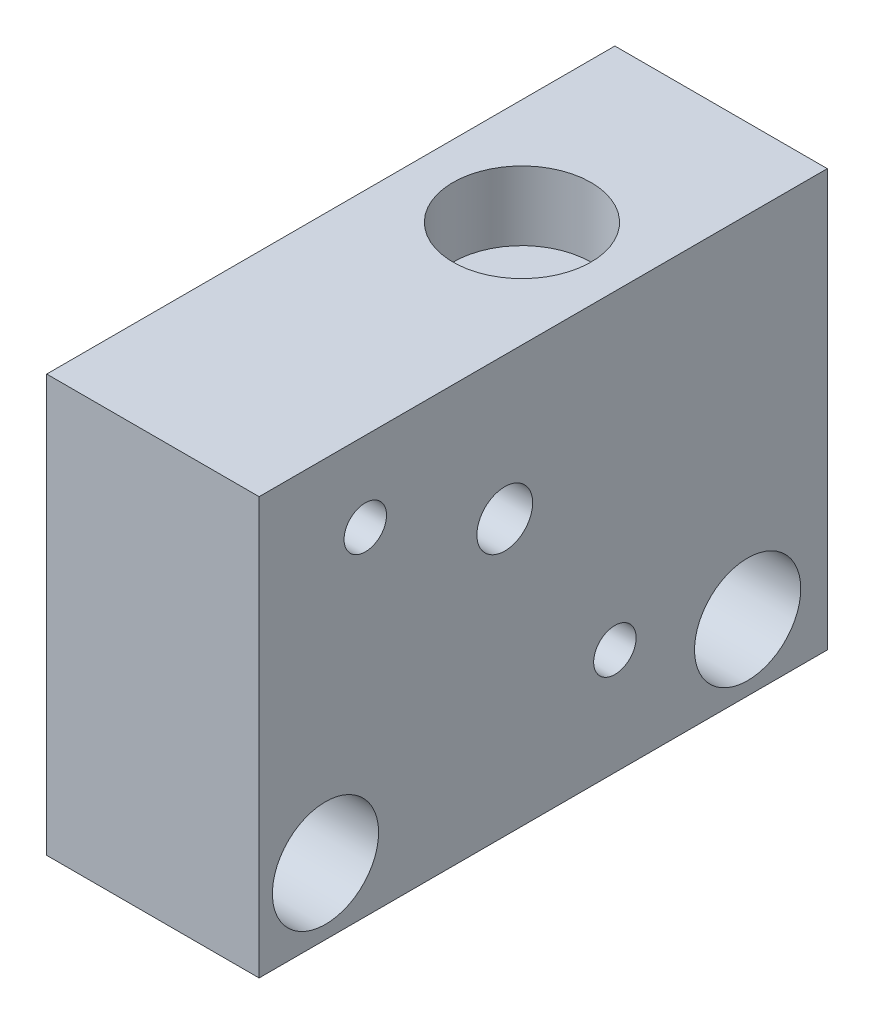
ISO-10303-21;
HEADER;
FILE_DESCRIPTION(('STEP AP214'),'2;1');
FILE_NAME('part.step','',(''),(''),'','','');
FILE_SCHEMA(('AUTOMOTIVE_DESIGN { 1 0 10303 214 1 1 1 1 }'));
ENDSEC;
DATA;
#1=APPLICATION_CONTEXT('core data for automotive mechanical design processes');
#2=APPLICATION_PROTOCOL_DEFINITION('international standard','automotive_design',2000,#1);
#3=PRODUCT_CONTEXT('',#1,'mechanical');
#4=PRODUCT('Part','Part','',(#3));
#5=PRODUCT_RELATED_PRODUCT_CATEGORY('part','',(#4));
#6=PRODUCT_DEFINITION_FORMATION('','',#4);
#7=PRODUCT_DEFINITION_CONTEXT('part definition',#1,'design');
#8=PRODUCT_DEFINITION('design','',#6,#7);
#9=PRODUCT_DEFINITION_SHAPE('','',#8);
#10=(LENGTH_UNIT() NAMED_UNIT(*) SI_UNIT(.MILLI.,.METRE.));
#11=(NAMED_UNIT(*) PLANE_ANGLE_UNIT() SI_UNIT($,.RADIAN.));
#12=(NAMED_UNIT(*) SI_UNIT($,.STERADIAN.) SOLID_ANGLE_UNIT());
#13=UNCERTAINTY_MEASURE_WITH_UNIT(LENGTH_MEASURE(1.E-05),#10,'distance_accuracy_value','');
#14=(GEOMETRIC_REPRESENTATION_CONTEXT(3) GLOBAL_UNCERTAINTY_ASSIGNED_CONTEXT((#13)) GLOBAL_UNIT_ASSIGNED_CONTEXT((#10,
#11,#12)) REPRESENTATION_CONTEXT('',''));
#15=CARTESIAN_POINT('',(0.,0.,0.));
#16=DIRECTION('',(0.,0.,1.));
#17=DIRECTION('',(1.,0.,0.));
#18=AXIS2_PLACEMENT_3D('',#15,#16,#17);
#19=CARTESIAN_POINT('',(-4.,15.7,13.9));
#20=DIRECTION('',(-1.,0.,0.));
#21=DIRECTION('',(0.,0.,1.));
#22=AXIS2_PLACEMENT_3D('',#19,#20,#21);
#23=PLANE('',#22);
#24=CARTESIAN_POINT('',(-4.,2.49999999999999,11.4));
#25=DIRECTION('',(1.,0.,0.));
#26=DIRECTION('',(0.,0.,-1.));
#27=AXIS2_PLACEMENT_3D('',#24,#25,#26);
#28=CIRCLE('',#27,1.5);
#29=CARTESIAN_POINT('',(-4.,2.49999999999999,9.9));
#30=VERTEX_POINT('',#29);
#31=EDGE_CURVE('E115',#30,#30,#28,.T.);
#32=ORIENTED_EDGE('',*,*,#31,.T.);
#33=EDGE_LOOP('',(#32));
#34=FACE_BOUND('',#33,.T.);
#35=CARTESIAN_POINT('',(-4.,2.49999999999999,-4.5));
#36=DIRECTION('',(1.,0.,0.));
#37=DIRECTION('',(0.,0.,-1.));
#38=AXIS2_PLACEMENT_3D('',#35,#36,#37);
#39=CIRCLE('',#38,1.5);
#40=CARTESIAN_POINT('',(-4.,2.49999999999999,-6.));
#41=VERTEX_POINT('',#40);
#42=EDGE_CURVE('E121',#41,#41,#39,.T.);
#43=ORIENTED_EDGE('',*,*,#42,.T.);
#44=EDGE_LOOP('',(#43));
#45=FACE_BOUND('',#44,.T.);
#46=CARTESIAN_POINT('',(-4.,10.3502973700561,4.64682698815077));
#47=DIRECTION('',(-1.,0.,0.));
#48=DIRECTION('',(0.,0.,1.));
#49=AXIS2_PLACEMENT_3D('',#46,#47,#48);
#50=CIRCLE('',#49,1.05);
#51=CARTESIAN_POINT('',(-4.,10.3502973700561,5.69682698815077));
#52=VERTEX_POINT('',#51);
#53=EDGE_CURVE('E139',#52,#52,#50,.T.);
#54=ORIENTED_EDGE('',*,*,#53,.F.);
#55=EDGE_LOOP('',(#54));
#56=FACE_BOUND('',#55,.T.);
#57=DIRECTION('',(0.,0.,-1.));
#58=VECTOR('',#57,1.);
#59=CARTESIAN_POINT('',(-4.,0.,13.9));
#60=LINE('',#59,#58);
#61=CARTESIAN_POINT('',(-4.,0.,13.9));
#62=VERTEX_POINT('',#61);
#63=CARTESIAN_POINT('',(-4.,0.,-7.5));
#64=VERTEX_POINT('',#63);
#65=EDGE_CURVE('E104',#62,#64,#60,.T.);
#66=ORIENTED_EDGE('',*,*,#65,.F.);
#67=DIRECTION('',(0.,-1.,0.));
#68=VECTOR('',#67,1.);
#69=CARTESIAN_POINT('',(-4.,15.7,13.9));
#70=LINE('',#69,#68);
#71=CARTESIAN_POINT('',(-4.,15.7,13.9));
#72=VERTEX_POINT('',#71);
#73=EDGE_CURVE('E12',#72,#62,#70,.T.);
#74=ORIENTED_EDGE('',*,*,#73,.F.);
#75=DIRECTION('',(0.,0.,-1.));
#76=VECTOR('',#75,1.);
#77=CARTESIAN_POINT('',(-4.,15.7,13.9));
#78=LINE('',#77,#76);
#79=CARTESIAN_POINT('',(-4.,15.7,-7.5));
#80=VERTEX_POINT('',#79);
#81=EDGE_CURVE('E98',#72,#80,#78,.T.);
#82=ORIENTED_EDGE('',*,*,#81,.T.);
#83=DIRECTION('',(0.,-1.,0.));
#84=VECTOR('',#83,1.);
#85=CARTESIAN_POINT('',(-4.,15.7,-7.5));
#86=LINE('',#85,#84);
#87=EDGE_CURVE('E77',#80,#64,#86,.T.);
#88=ORIENTED_EDGE('',*,*,#87,.T.);
#89=EDGE_LOOP('',(#66,#74,#82,#88));
#90=FACE_BOUND('',#89,.T.);
#91=ADVANCED_FACE('F36',(#34,#45,#56,#90),#23,.T.);
#92=CARTESIAN_POINT('',(-4.,15.7,13.9));
#93=DIRECTION('',(0.,0.,-1.));
#94=DIRECTION('',(-1.,0.,0.));
#95=AXIS2_PLACEMENT_3D('',#92,#93,#94);
#96=PLANE('',#95);
#97=DIRECTION('',(1.,0.,0.));
#98=VECTOR('',#97,1.);
#99=CARTESIAN_POINT('',(-4.,0.,13.9));
#100=LINE('',#99,#98);
#101=CARTESIAN_POINT('',(4.,0.,13.9));
#102=VERTEX_POINT('',#101);
#103=EDGE_CURVE('E69',#62,#102,#100,.T.);
#104=ORIENTED_EDGE('',*,*,#103,.T.);
#105=DIRECTION('',(0.,-1.,0.));
#106=VECTOR('',#105,1.);
#107=CARTESIAN_POINT('',(4.,15.7,13.9));
#108=LINE('',#107,#106);
#109=CARTESIAN_POINT('',(4.,15.7,13.9));
#110=VERTEX_POINT('',#109);
#111=EDGE_CURVE('E45',#110,#102,#108,.T.);
#112=ORIENTED_EDGE('',*,*,#111,.F.);
#113=DIRECTION('',(1.,0.,0.));
#114=VECTOR('',#113,1.);
#115=CARTESIAN_POINT('',(-4.,15.7,13.9));
#116=LINE('',#115,#114);
#117=EDGE_CURVE('E87',#72,#110,#116,.T.);
#118=ORIENTED_EDGE('',*,*,#117,.F.);
#119=ORIENTED_EDGE('',*,*,#73,.T.);
#120=EDGE_LOOP('',(#104,#112,#118,#119));
#121=FACE_BOUND('',#120,.T.);
#122=ADVANCED_FACE('F172',(#121),#96,.F.);
#123=CARTESIAN_POINT('',(4.,15.7,13.9));
#124=DIRECTION('',(-1.,0.,0.));
#125=DIRECTION('',(0.,0.,1.));
#126=AXIS2_PLACEMENT_3D('',#123,#124,#125);
#127=PLANE('',#126);
#128=CARTESIAN_POINT('',(4.,12.7,9.9));
#129=DIRECTION('',(1.,0.,0.));
#130=DIRECTION('',(0.,0.,-1.));
#131=AXIS2_PLACEMENT_3D('',#128,#129,#130);
#132=CIRCLE('',#131,0.800000000000001);
#133=CARTESIAN_POINT('',(4.,12.7,9.1));
#134=VERTEX_POINT('',#133);
#135=EDGE_CURVE('E233',#134,#134,#132,.T.);
#136=ORIENTED_EDGE('',*,*,#135,.F.);
#137=EDGE_LOOP('',(#136));
#138=FACE_BOUND('',#137,.T.);
#139=CARTESIAN_POINT('',(4.,4.,0.5));
#140=DIRECTION('',(1.,0.,0.));
#141=DIRECTION('',(0.,0.,-1.));
#142=AXIS2_PLACEMENT_3D('',#139,#140,#141);
#143=CIRCLE('',#142,0.800000000000001);
#144=CARTESIAN_POINT('',(4.,4.,-0.300000000000001));
#145=VERTEX_POINT('',#144);
#146=EDGE_CURVE('E236',#145,#145,#143,.T.);
#147=ORIENTED_EDGE('',*,*,#146,.F.);
#148=EDGE_LOOP('',(#147));
#149=FACE_BOUND('',#148,.T.);
#150=CARTESIAN_POINT('',(4.,2.49999999999999,-4.5));
#151=DIRECTION('',(1.,0.,0.));
#152=DIRECTION('',(0.,0.,-1.));
#153=AXIS2_PLACEMENT_3D('',#150,#151,#152);
#154=CIRCLE('',#153,2.);
#155=CARTESIAN_POINT('',(4.,2.49999999999999,-6.5));
#156=VERTEX_POINT('',#155);
#157=EDGE_CURVE('E132',#156,#156,#154,.T.);
#158=ORIENTED_EDGE('',*,*,#157,.F.);
#159=EDGE_LOOP('',(#158));
#160=FACE_BOUND('',#159,.T.);
#161=CARTESIAN_POINT('',(4.,2.49999999999999,11.4));
#162=DIRECTION('',(1.,0.,0.));
#163=DIRECTION('',(0.,0.,-1.));
#164=AXIS2_PLACEMENT_3D('',#161,#162,#163);
#165=CIRCLE('',#164,2.);
#166=CARTESIAN_POINT('',(4.,2.49999999999999,9.4));
#167=VERTEX_POINT('',#166);
#168=EDGE_CURVE('E136',#167,#167,#165,.T.);
#169=ORIENTED_EDGE('',*,*,#168,.F.);
#170=EDGE_LOOP('',(#169));
#171=FACE_BOUND('',#170,.T.);
#172=CARTESIAN_POINT('',(4.,10.3502973700561,4.64682698815077));
#173=DIRECTION('',(-1.,0.,0.));
#174=DIRECTION('',(0.,0.,1.));
#175=AXIS2_PLACEMENT_3D('',#172,#173,#174);
#176=CIRCLE('',#175,1.05);
#177=CARTESIAN_POINT('',(4.,10.3502973700561,5.69682698815077));
#178=VERTEX_POINT('',#177);
#179=EDGE_CURVE('E144',#178,#178,#176,.T.);
#180=ORIENTED_EDGE('',*,*,#179,.T.);
#181=EDGE_LOOP('',(#180));
#182=FACE_BOUND('',#181,.T.);
#183=DIRECTION('',(0.,0.,-1.));
#184=VECTOR('',#183,1.);
#185=CARTESIAN_POINT('',(4.,0.,13.9));
#186=LINE('',#185,#184);
#187=CARTESIAN_POINT('',(4.,0.,-7.5));
#188=VERTEX_POINT('',#187);
#189=EDGE_CURVE('E94',#102,#188,#186,.T.);
#190=ORIENTED_EDGE('',*,*,#189,.T.);
#191=DIRECTION('',(0.,-1.,0.));
#192=VECTOR('',#191,1.);
#193=CARTESIAN_POINT('',(4.,15.7,-7.5));
#194=LINE('',#193,#192);
#195=CARTESIAN_POINT('',(4.,15.7,-7.5));
#196=VERTEX_POINT('',#195);
#197=EDGE_CURVE('E91',#196,#188,#194,.T.);
#198=ORIENTED_EDGE('',*,*,#197,.F.);
#199=DIRECTION('',(0.,0.,-1.));
#200=VECTOR('',#199,1.);
#201=CARTESIAN_POINT('',(4.,15.7,13.9));
#202=LINE('',#201,#200);
#203=EDGE_CURVE('E82',#110,#196,#202,.T.);
#204=ORIENTED_EDGE('',*,*,#203,.F.);
#205=ORIENTED_EDGE('',*,*,#111,.T.);
#206=EDGE_LOOP('',(#190,#198,#204,#205));
#207=FACE_BOUND('',#206,.T.);
#208=ADVANCED_FACE('F92',(#138,#149,#160,#171,#182,#207),#127,.F.);
#209=CARTESIAN_POINT('',(-4.,15.7,-7.5));
#210=DIRECTION('',(0.,0.,-1.));
#211=DIRECTION('',(-1.,0.,0.));
#212=AXIS2_PLACEMENT_3D('',#209,#210,#211);
#213=PLANE('',#212);
#214=DIRECTION('',(1.,0.,0.));
#215=VECTOR('',#214,1.);
#216=CARTESIAN_POINT('',(-4.,0.,-7.5));
#217=LINE('',#216,#215);
#218=EDGE_CURVE('E107',#64,#188,#217,.T.);
#219=ORIENTED_EDGE('',*,*,#218,.F.);
#220=ORIENTED_EDGE('',*,*,#87,.F.);
#221=DIRECTION('',(1.,0.,0.));
#222=VECTOR('',#221,1.);
#223=CARTESIAN_POINT('',(-4.,15.7,-7.5));
#224=LINE('',#223,#222);
#225=EDGE_CURVE('E86',#80,#196,#224,.T.);
#226=ORIENTED_EDGE('',*,*,#225,.T.);
#227=ORIENTED_EDGE('',*,*,#197,.T.);
#228=EDGE_LOOP('',(#219,#220,#226,#227));
#229=FACE_BOUND('',#228,.T.);
#230=ADVANCED_FACE('F97',(#229),#213,.T.);
#231=CARTESIAN_POINT('',(0.,15.7,0.));
#232=DIRECTION('',(0.,-1.,0.));
#233=DIRECTION('',(0.,0.,-1.));
#234=AXIS2_PLACEMENT_3D('',#231,#232,#233);
#235=PLANE('',#234);
#236=CARTESIAN_POINT('',(0.,15.7,0.));
#237=DIRECTION('',(0.,-1.,0.));
#238=DIRECTION('',(0.,0.,-1.));
#239=AXIS2_PLACEMENT_3D('',#236,#237,#238);
#240=CIRCLE('',#239,2.6);
#241=CARTESIAN_POINT('',(0.,15.7,-2.6));
#242=VERTEX_POINT('',#241);
#243=EDGE_CURVE('E147',#242,#242,#240,.T.);
#244=ORIENTED_EDGE('',*,*,#243,.T.);
#245=EDGE_LOOP('',(#244));
#246=FACE_BOUND('',#245,.T.);
#247=ORIENTED_EDGE('',*,*,#81,.F.);
#248=ORIENTED_EDGE('',*,*,#117,.T.);
#249=ORIENTED_EDGE('',*,*,#203,.T.);
#250=ORIENTED_EDGE('',*,*,#225,.F.);
#251=EDGE_LOOP('',(#247,#248,#249,#250));
#252=FACE_BOUND('',#251,.T.);
#253=ADVANCED_FACE('F85',(#246,#252),#235,.F.);
#254=CARTESIAN_POINT('',(0.,0.,0.));
#255=DIRECTION('',(0.,-1.,0.));
#256=DIRECTION('',(0.,0.,-1.));
#257=AXIS2_PLACEMENT_3D('',#254,#255,#256);
#258=PLANE('',#257);
#259=ORIENTED_EDGE('',*,*,#65,.T.);
#260=ORIENTED_EDGE('',*,*,#218,.T.);
#261=ORIENTED_EDGE('',*,*,#189,.F.);
#262=ORIENTED_EDGE('',*,*,#103,.F.);
#263=EDGE_LOOP('',(#259,#260,#261,#262));
#264=FACE_BOUND('',#263,.T.);
#265=ADVANCED_FACE('F158',(#264),#258,.T.);
#266=CARTESIAN_POINT('',(0.,13.1,0.));
#267=DIRECTION('',(0.,1.,0.));
#268=DIRECTION('',(0.,0.,1.));
#269=AXIS2_PLACEMENT_3D('',#266,#267,#268);
#270=CYLINDRICAL_SURFACE('',#269,2.6);
#271=CARTESIAN_POINT('',(0.,13.1,0.));
#272=DIRECTION('',(0.,-1.,0.));
#273=DIRECTION('',(0.,0.,-1.));
#274=AXIS2_PLACEMENT_3D('',#271,#272,#273);
#275=CIRCLE('',#274,2.6);
#276=CARTESIAN_POINT('',(0.,13.1,-2.6));
#277=VERTEX_POINT('',#276);
#278=EDGE_CURVE('E108',#277,#277,#275,.T.);
#279=ORIENTED_EDGE('',*,*,#278,.T.);
#280=EDGE_LOOP('',(#279));
#281=FACE_BOUND('',#280,.T.);
#282=ORIENTED_EDGE('',*,*,#243,.F.);
#283=EDGE_LOOP('',(#282));
#284=FACE_BOUND('',#283,.T.);
#285=ADVANCED_FACE('F155',(#281,#284),#270,.F.);
#286=CARTESIAN_POINT('',(0.,13.1,0.));
#287=DIRECTION('',(0.,-1.,0.));
#288=DIRECTION('',(0.,0.,-1.));
#289=AXIS2_PLACEMENT_3D('',#286,#287,#288);
#290=PLANE('',#289);
#291=ORIENTED_EDGE('',*,*,#278,.F.);
#292=EDGE_LOOP('',(#291));
#293=FACE_BOUND('',#292,.T.);
#294=ADVANCED_FACE('F157',(#293),#290,.F.);
#295=CARTESIAN_POINT('',(4.,10.3502973700561,4.64682698815077));
#296=DIRECTION('',(-1.,0.,0.));
#297=DIRECTION('',(0.,0.,1.));
#298=AXIS2_PLACEMENT_3D('',#295,#296,#297);
#299=CYLINDRICAL_SURFACE('',#298,1.05);
#300=ORIENTED_EDGE('',*,*,#179,.F.);
#301=EDGE_LOOP('',(#300));
#302=FACE_BOUND('',#301,.T.);
#303=ORIENTED_EDGE('',*,*,#53,.T.);
#304=EDGE_LOOP('',(#303));
#305=FACE_BOUND('',#304,.T.);
#306=ADVANCED_FACE('F165',(#302,#305),#299,.F.);
#307=CARTESIAN_POINT('',(-2.,15.7,13.9));
#308=DIRECTION('',(-1.,0.,0.));
#309=DIRECTION('',(0.,0.,1.));
#310=AXIS2_PLACEMENT_3D('',#307,#308,#309);
#311=PLANE('',#310);
#312=CARTESIAN_POINT('',(-2.,2.49999999999999,11.4));
#313=DIRECTION('',(-1.,0.,0.));
#314=DIRECTION('',(0.,0.,1.));
#315=AXIS2_PLACEMENT_3D('',#312,#313,#314);
#316=CIRCLE('',#315,1.5);
#317=CARTESIAN_POINT('',(-2.,2.49999999999999,12.9));
#318=VERTEX_POINT('',#317);
#319=EDGE_CURVE('E39',#318,#318,#316,.T.);
#320=ORIENTED_EDGE('',*,*,#319,.T.);
#321=EDGE_LOOP('',(#320));
#322=FACE_BOUND('',#321,.T.);
#323=CARTESIAN_POINT('',(-2.,2.49999999999999,11.4));
#324=DIRECTION('',(-1.,0.,0.));
#325=DIRECTION('',(0.,0.,1.));
#326=AXIS2_PLACEMENT_3D('',#323,#324,#325);
#327=CIRCLE('',#326,2.);
#328=CARTESIAN_POINT('',(-2.,2.49999999999999,13.4));
#329=VERTEX_POINT('',#328);
#330=EDGE_CURVE('E119',#329,#329,#327,.F.);
#331=ORIENTED_EDGE('',*,*,#330,.T.);
#332=EDGE_LOOP('',(#331));
#333=FACE_BOUND('',#332,.T.);
#334=ADVANCED_FACE('F185',(#322,#333),#311,.F.);
#335=CARTESIAN_POINT('',(-9.65685424949238,2.49999999999999,11.4));
#336=DIRECTION('',(1.,0.,0.));
#337=DIRECTION('',(0.,0.,-1.));
#338=AXIS2_PLACEMENT_3D('',#335,#336,#337);
#339=CYLINDRICAL_SURFACE('',#338,2.);
#340=ORIENTED_EDGE('',*,*,#168,.T.);
#341=EDGE_LOOP('',(#340));
#342=FACE_BOUND('',#341,.T.);
#343=ORIENTED_EDGE('',*,*,#330,.F.);
#344=EDGE_LOOP('',(#343));
#345=FACE_BOUND('',#344,.T.);
#346=ADVANCED_FACE('F191',(#342,#345),#339,.F.);
#347=CARTESIAN_POINT('',(-2.,15.7,13.9));
#348=DIRECTION('',(-1.,0.,0.));
#349=DIRECTION('',(0.,0.,1.));
#350=AXIS2_PLACEMENT_3D('',#347,#348,#349);
#351=PLANE('',#350);
#352=CARTESIAN_POINT('',(-2.,2.49999999999999,-4.5));
#353=DIRECTION('',(-1.,0.,0.));
#354=DIRECTION('',(0.,0.,1.));
#355=AXIS2_PLACEMENT_3D('',#352,#353,#354);
#356=CIRCLE('',#355,1.5);
#357=CARTESIAN_POINT('',(-2.,2.49999999999999,-3.));
#358=VERTEX_POINT('',#357);
#359=EDGE_CURVE('E113',#358,#358,#356,.T.);
#360=ORIENTED_EDGE('',*,*,#359,.T.);
#361=EDGE_LOOP('',(#360));
#362=FACE_BOUND('',#361,.T.);
#363=CARTESIAN_POINT('',(-2.,2.49999999999999,-4.5));
#364=DIRECTION('',(-1.,0.,0.));
#365=DIRECTION('',(0.,0.,1.));
#366=AXIS2_PLACEMENT_3D('',#363,#364,#365);
#367=CIRCLE('',#366,2.);
#368=CARTESIAN_POINT('',(-2.,2.49999999999999,-2.5));
#369=VERTEX_POINT('',#368);
#370=EDGE_CURVE('E135',#369,#369,#367,.F.);
#371=ORIENTED_EDGE('',*,*,#370,.T.);
#372=EDGE_LOOP('',(#371));
#373=FACE_BOUND('',#372,.T.);
#374=ADVANCED_FACE('F197',(#362,#373),#351,.F.);
#375=CARTESIAN_POINT('',(-9.65685424949238,2.49999999999999,-4.5));
#376=DIRECTION('',(1.,0.,0.));
#377=DIRECTION('',(0.,0.,-1.));
#378=AXIS2_PLACEMENT_3D('',#375,#376,#377);
#379=CYLINDRICAL_SURFACE('',#378,2.);
#380=ORIENTED_EDGE('',*,*,#157,.T.);
#381=EDGE_LOOP('',(#380));
#382=FACE_BOUND('',#381,.T.);
#383=ORIENTED_EDGE('',*,*,#370,.F.);
#384=EDGE_LOOP('',(#383));
#385=FACE_BOUND('',#384,.T.);
#386=ADVANCED_FACE('F202',(#382,#385),#379,.F.);
#387=CARTESIAN_POINT('',(-4.,2.49999999999999,-4.5));
#388=DIRECTION('',(1.,0.,0.));
#389=DIRECTION('',(0.,0.,-1.));
#390=AXIS2_PLACEMENT_3D('',#387,#388,#389);
#391=CYLINDRICAL_SURFACE('',#390,1.5);
#392=ORIENTED_EDGE('',*,*,#42,.F.);
#393=EDGE_LOOP('',(#392));
#394=FACE_BOUND('',#393,.T.);
#395=ORIENTED_EDGE('',*,*,#359,.F.);
#396=EDGE_LOOP('',(#395));
#397=FACE_BOUND('',#396,.T.);
#398=ADVANCED_FACE('F205',(#394,#397),#391,.F.);
#399=CARTESIAN_POINT('',(-4.,2.49999999999999,11.4));
#400=DIRECTION('',(1.,0.,0.));
#401=DIRECTION('',(0.,0.,-1.));
#402=AXIS2_PLACEMENT_3D('',#399,#400,#401);
#403=CYLINDRICAL_SURFACE('',#402,1.5);
#404=ORIENTED_EDGE('',*,*,#31,.F.);
#405=EDGE_LOOP('',(#404));
#406=FACE_BOUND('',#405,.T.);
#407=ORIENTED_EDGE('',*,*,#319,.F.);
#408=EDGE_LOOP('',(#407));
#409=FACE_BOUND('',#408,.T.);
#410=ADVANCED_FACE('F209',(#406,#409),#403,.F.);
#411=CARTESIAN_POINT('',(0.,4.,0.5));
#412=DIRECTION('',(1.,0.,0.));
#413=DIRECTION('',(0.,0.,-1.));
#414=AXIS2_PLACEMENT_3D('',#411,#412,#413);
#415=CYLINDRICAL_SURFACE('',#414,0.800000000000001);
#416=CARTESIAN_POINT('',(0.,4.,0.5));
#417=DIRECTION('',(1.,0.,0.));
#418=DIRECTION('',(0.,0.,-1.));
#419=AXIS2_PLACEMENT_3D('',#416,#417,#418);
#420=CIRCLE('',#419,0.800000000000001);
#421=CARTESIAN_POINT('',(0.,4.,-0.300000000000001));
#422=VERTEX_POINT('',#421);
#423=EDGE_CURVE('E129',#422,#422,#420,.T.);
#424=ORIENTED_EDGE('',*,*,#423,.F.);
#425=EDGE_LOOP('',(#424));
#426=FACE_BOUND('',#425,.T.);
#427=ORIENTED_EDGE('',*,*,#146,.T.);
#428=EDGE_LOOP('',(#427));
#429=FACE_BOUND('',#428,.T.);
#430=ADVANCED_FACE('F213',(#426,#429),#415,.F.);
#431=CARTESIAN_POINT('',(0.,4.,0.5));
#432=DIRECTION('',(1.,0.,0.));
#433=DIRECTION('',(0.,0.,-1.));
#434=AXIS2_PLACEMENT_3D('',#431,#432,#433);
#435=PLANE('',#434);
#436=ORIENTED_EDGE('',*,*,#423,.T.);
#437=EDGE_LOOP('',(#436));
#438=FACE_BOUND('',#437,.T.);
#439=ADVANCED_FACE('F215',(#438),#435,.T.);
#440=CARTESIAN_POINT('',(0.,12.7,9.9));
#441=DIRECTION('',(1.,0.,0.));
#442=DIRECTION('',(0.,0.,-1.));
#443=AXIS2_PLACEMENT_3D('',#440,#441,#442);
#444=CYLINDRICAL_SURFACE('',#443,0.800000000000001);
#445=CARTESIAN_POINT('',(0.,12.7,9.9));
#446=DIRECTION('',(1.,0.,0.));
#447=DIRECTION('',(0.,0.,-1.));
#448=AXIS2_PLACEMENT_3D('',#445,#446,#447);
#449=CIRCLE('',#448,0.800000000000001);
#450=CARTESIAN_POINT('',(0.,12.7,9.1));
#451=VERTEX_POINT('',#450);
#452=EDGE_CURVE('E126',#451,#451,#449,.T.);
#453=ORIENTED_EDGE('',*,*,#452,.F.);
#454=EDGE_LOOP('',(#453));
#455=FACE_BOUND('',#454,.T.);
#456=ORIENTED_EDGE('',*,*,#135,.T.);
#457=EDGE_LOOP('',(#456));
#458=FACE_BOUND('',#457,.T.);
#459=ADVANCED_FACE('F218',(#455,#458),#444,.F.);
#460=CARTESIAN_POINT('',(0.,12.7,9.9));
#461=DIRECTION('',(1.,0.,0.));
#462=DIRECTION('',(0.,0.,-1.));
#463=AXIS2_PLACEMENT_3D('',#460,#461,#462);
#464=PLANE('',#463);
#465=ORIENTED_EDGE('',*,*,#452,.T.);
#466=EDGE_LOOP('',(#465));
#467=FACE_BOUND('',#466,.T.);
#468=ADVANCED_FACE('F225',(#467),#464,.T.);
#469=CLOSED_SHELL('',(#91,#122,#208,#230,#253,#265,#285,#294,#306,#334,#346,#374,#386,#398,#410,
#430,#439,#459,#468));
#470=MANIFOLD_SOLID_BREP('B2',#469);
#471=ADVANCED_BREP_SHAPE_REPRESENTATION('',(#18,#470),#14);
#472=SHAPE_DEFINITION_REPRESENTATION(#9,#471);
ENDSEC;
END-ISO-10303-21;
